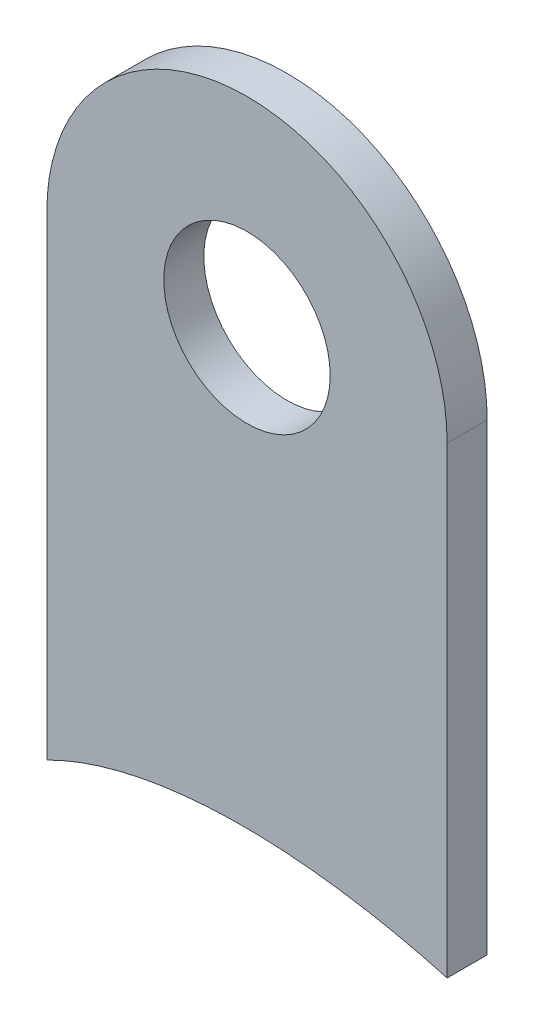
ISO-10303-21;
HEADER;
FILE_DESCRIPTION(('STEP AP214'),'2;1');
FILE_NAME('part.step','',(''),(''),'','','');
FILE_SCHEMA(('AUTOMOTIVE_DESIGN { 1 0 10303 214 1 1 1 1 }'));
ENDSEC;
DATA;
#1=APPLICATION_CONTEXT('core data for automotive mechanical design processes');
#2=APPLICATION_PROTOCOL_DEFINITION('international standard','automotive_design',2000,#1);
#3=PRODUCT_CONTEXT('',#1,'mechanical');
#4=PRODUCT('Part','Part','',(#3));
#5=PRODUCT_RELATED_PRODUCT_CATEGORY('part','',(#4));
#6=PRODUCT_DEFINITION_FORMATION('','',#4);
#7=PRODUCT_DEFINITION_CONTEXT('part definition',#1,'design');
#8=PRODUCT_DEFINITION('design','',#6,#7);
#9=PRODUCT_DEFINITION_SHAPE('','',#8);
#10=(LENGTH_UNIT() NAMED_UNIT(*) SI_UNIT(.MILLI.,.METRE.));
#11=(NAMED_UNIT(*) PLANE_ANGLE_UNIT() SI_UNIT($,.RADIAN.));
#12=(NAMED_UNIT(*) SI_UNIT($,.STERADIAN.) SOLID_ANGLE_UNIT());
#13=UNCERTAINTY_MEASURE_WITH_UNIT(LENGTH_MEASURE(1.E-05),#10,'distance_accuracy_value','');
#14=(GEOMETRIC_REPRESENTATION_CONTEXT(3) GLOBAL_UNCERTAINTY_ASSIGNED_CONTEXT((#13)) GLOBAL_UNIT_ASSIGNED_CONTEXT((#10,
#11,#12)) REPRESENTATION_CONTEXT('',''));
#15=CARTESIAN_POINT('',(0.,0.,0.));
#16=DIRECTION('',(0.,0.,1.));
#17=DIRECTION('',(1.,0.,0.));
#18=AXIS2_PLACEMENT_3D('',#15,#16,#17);
#19=CARTESIAN_POINT('',(0.,0.,1.5875));
#20=DIRECTION('',(0.,0.,-1.));
#21=DIRECTION('',(-1.,0.,0.));
#22=AXIS2_PLACEMENT_3D('',#19,#20,#21);
#23=CYLINDRICAL_SURFACE('',#22,7.9375);
#24=CARTESIAN_POINT('',(0.,0.,0.));
#25=DIRECTION('',(0.,0.,1.));
#26=DIRECTION('',(1.,0.,0.));
#27=AXIS2_PLACEMENT_3D('',#24,#25,#26);
#28=CIRCLE('',#27,7.9375);
#29=CARTESIAN_POINT('',(7.9375,0.,0.));
#30=VERTEX_POINT('',#29);
#31=CARTESIAN_POINT('',(-7.9375,0.,0.));
#32=VERTEX_POINT('',#31);
#33=EDGE_CURVE('E87',#30,#32,#28,.T.);
#34=ORIENTED_EDGE('',*,*,#33,.T.);
#35=DIRECTION('',(0.,0.,-1.));
#36=VECTOR('',#35,1.);
#37=CARTESIAN_POINT('',(-7.9375,0.,1.5875));
#38=LINE('',#37,#36);
#39=CARTESIAN_POINT('',(-7.9375,0.,1.5875));
#40=VERTEX_POINT('',#39);
#41=EDGE_CURVE('E11',#40,#32,#38,.T.);
#42=ORIENTED_EDGE('',*,*,#41,.F.);
#43=CARTESIAN_POINT('',(0.,0.,1.5875));
#44=DIRECTION('',(0.,0.,1.));
#45=DIRECTION('',(1.,0.,0.));
#46=AXIS2_PLACEMENT_3D('',#43,#44,#45);
#47=CIRCLE('',#46,7.9375);
#48=CARTESIAN_POINT('',(7.9375,0.,1.5875));
#49=VERTEX_POINT('',#48);
#50=EDGE_CURVE('E81',#49,#40,#47,.T.);
#51=ORIENTED_EDGE('',*,*,#50,.F.);
#52=DIRECTION('',(0.,0.,-1.));
#53=VECTOR('',#52,1.);
#54=CARTESIAN_POINT('',(7.9375,0.,1.5875));
#55=LINE('',#54,#53);
#56=EDGE_CURVE('E42',#49,#30,#55,.T.);
#57=ORIENTED_EDGE('',*,*,#56,.T.);
#58=EDGE_LOOP('',(#34,#42,#51,#57));
#59=FACE_BOUND('',#58,.T.);
#60=ADVANCED_FACE('F35',(#59),#23,.T.);
#61=CARTESIAN_POINT('',(-7.9375,0.,1.5875));
#62=DIRECTION('',(1.,0.,0.));
#63=DIRECTION('',(0.,1.,0.));
#64=AXIS2_PLACEMENT_3D('',#61,#62,#63);
#65=PLANE('',#64);
#66=DIRECTION('',(0.,-1.,0.));
#67=VECTOR('',#66,1.);
#68=CARTESIAN_POINT('',(-7.9375,0.,0.));
#69=LINE('',#68,#67);
#70=CARTESIAN_POINT('',(-7.9375,-18.8233181908482,0.));
#71=VERTEX_POINT('',#70);
#72=EDGE_CURVE('E82',#32,#71,#69,.T.);
#73=ORIENTED_EDGE('',*,*,#72,.T.);
#74=DIRECTION('',(0.,0.,-1.));
#75=VECTOR('',#74,1.);
#76=CARTESIAN_POINT('',(-7.9375,-18.8233181908482,1.5875));
#77=LINE('',#76,#75);
#78=CARTESIAN_POINT('',(-7.93749999999999,-18.8233181908482,1.5875));
#79=VERTEX_POINT('',#78);
#80=EDGE_CURVE('E49',#71,#79,#77,.F.);
#81=ORIENTED_EDGE('',*,*,#80,.T.);
#82=DIRECTION('',(0.,-1.,0.));
#83=VECTOR('',#82,1.);
#84=CARTESIAN_POINT('',(-7.9375,0.,1.5875));
#85=LINE('',#84,#83);
#86=EDGE_CURVE('E98',#40,#79,#85,.T.);
#87=ORIENTED_EDGE('',*,*,#86,.F.);
#88=ORIENTED_EDGE('',*,*,#41,.T.);
#89=EDGE_LOOP('',(#73,#81,#87,#88));
#90=FACE_BOUND('',#89,.T.);
#91=ADVANCED_FACE('F135',(#90),#65,.F.);
#92=CARTESIAN_POINT('',(7.9375,0.,1.5875));
#93=DIRECTION('',(-1.,0.,0.));
#94=DIRECTION('',(0.,-1.,0.));
#95=AXIS2_PLACEMENT_3D('',#92,#93,#94);
#96=PLANE('',#95);
#97=DIRECTION('',(0.,1.,0.));
#98=VECTOR('',#97,1.);
#99=CARTESIAN_POINT('',(7.9375,0.,1.5875));
#100=LINE('',#99,#98);
#101=CARTESIAN_POINT('',(7.93750000000328,-18.3708664452322,1.5875));
#102=VERTEX_POINT('',#101);
#103=EDGE_CURVE('E58',#102,#49,#100,.T.);
#104=ORIENTED_EDGE('',*,*,#103,.F.);
#105=DIRECTION('',(0.,0.,-1.));
#106=VECTOR('',#105,1.);
#107=CARTESIAN_POINT('',(7.9375,-18.3708664452313,1.5875));
#108=LINE('',#107,#106);
#109=CARTESIAN_POINT('',(7.93750000000328,-18.3708664452322,0.));
#110=VERTEX_POINT('',#109);
#111=EDGE_CURVE('E78',#102,#110,#108,.T.);
#112=ORIENTED_EDGE('',*,*,#111,.T.);
#113=DIRECTION('',(0.,1.,0.));
#114=VECTOR('',#113,1.);
#115=CARTESIAN_POINT('',(7.9375,0.,0.));
#116=LINE('',#115,#114);
#117=EDGE_CURVE('E72',#110,#30,#116,.T.);
#118=ORIENTED_EDGE('',*,*,#117,.T.);
#119=ORIENTED_EDGE('',*,*,#56,.F.);
#120=EDGE_LOOP('',(#104,#112,#118,#119));
#121=FACE_BOUND('',#120,.T.);
#122=ADVANCED_FACE('F74',(#121),#96,.F.);
#123=CARTESIAN_POINT('',(0.,0.,1.5875));
#124=DIRECTION('',(0.,0.,1.));
#125=DIRECTION('',(1.,0.,0.));
#126=AXIS2_PLACEMENT_3D('',#123,#124,#125);
#127=PLANE('',#126);
#128=CARTESIAN_POINT('',(-12.0302858960899,-22.899436182964,1.5875));
#129=CARTESIAN_POINT('',(-1.65246713113241,0.283766306806422,1.5875));
#130=CARTESIAN_POINT('',(38.2842648459578,-17.5936674388465,1.5875));
#131=CARTESIAN_POINT('',(27.9064460810003,-40.7768699286169,1.5875));
#132=CARTESIAN_POINT('',(17.5286273160427,-63.9600724183873,1.5875));
#133=CARTESIAN_POINT('',(-22.4081046610475,-46.0826386727343,1.5875));
#134=CARTESIAN_POINT('',(-12.0302858960899,-22.899436182964,1.5875));
#135=(BOUNDED_CURVE() B_SPLINE_CURVE(3,(#128,#129,#130,#131,#132,#133,#134),.UNSPECIFIED.,.T.,
.F.) B_SPLINE_CURVE_WITH_KNOTS((4,3,4),(0.,0.5,1.),
.UNSPECIFIED.) CURVE() GEOMETRIC_REPRESENTATION_ITEM() RATIONAL_B_SPLINE_CURVE((1.,
0.333333333333333,0.333333333333333,1.,0.333333333333333,0.333333333333333,1.)) REPRESENTATION_ITEM(''));
#136=EDGE_CURVE('E106',#79,#102,#135,.T.);
#137=ORIENTED_EDGE('',*,*,#136,.T.);
#138=ORIENTED_EDGE('',*,*,#103,.T.);
#139=ORIENTED_EDGE('',*,*,#50,.T.);
#140=ORIENTED_EDGE('',*,*,#86,.T.);
#141=EDGE_LOOP('',(#137,#138,#139,#140));
#142=FACE_BOUND('',#141,.T.);
#143=CARTESIAN_POINT('',(0.,0.,1.5875));
#144=DIRECTION('',(0.,0.,1.));
#145=DIRECTION('',(1.,0.,0.));
#146=AXIS2_PLACEMENT_3D('',#143,#144,#145);
#147=CIRCLE('',#146,3.3);
#148=CARTESIAN_POINT('',(3.3,0.,1.5875));
#149=VERTEX_POINT('',#148);
#150=EDGE_CURVE('E94',#149,#149,#147,.T.);
#151=ORIENTED_EDGE('',*,*,#150,.F.);
#152=EDGE_LOOP('',(#151));
#153=FACE_BOUND('',#152,.T.);
#154=ADVANCED_FACE('F128',(#142,#153),#127,.T.);
#155=CARTESIAN_POINT('',(0.,0.,0.));
#156=DIRECTION('',(0.,0.,1.));
#157=DIRECTION('',(1.,0.,0.));
#158=AXIS2_PLACEMENT_3D('',#155,#156,#157);
#159=PLANE('',#158);
#160=CARTESIAN_POINT('',(0.,0.,0.));
#161=DIRECTION('',(0.,0.,1.));
#162=DIRECTION('',(1.,0.,0.));
#163=AXIS2_PLACEMENT_3D('',#160,#161,#162);
#164=CIRCLE('',#163,3.3);
#165=CARTESIAN_POINT('',(3.3,0.,0.));
#166=VERTEX_POINT('',#165);
#167=EDGE_CURVE('E90',#166,#166,#164,.T.);
#168=ORIENTED_EDGE('',*,*,#167,.T.);
#169=EDGE_LOOP('',(#168));
#170=FACE_BOUND('',#169,.T.);
#171=ORIENTED_EDGE('',*,*,#117,.F.);
#172=CARTESIAN_POINT('',(-12.0302858960899,-22.899436182964,0.));
#173=CARTESIAN_POINT('',(-1.65246713113241,0.283766306806422,0.));
#174=CARTESIAN_POINT('',(38.2842648459578,-17.5936674388465,0.));
#175=CARTESIAN_POINT('',(27.9064460810003,-40.7768699286169,0.));
#176=CARTESIAN_POINT('',(17.5286273160427,-63.9600724183873,0.));
#177=CARTESIAN_POINT('',(-22.4081046610475,-46.0826386727343,0.));
#178=CARTESIAN_POINT('',(-12.0302858960899,-22.899436182964,0.));
#179=(BOUNDED_CURVE() B_SPLINE_CURVE(3,(#172,#173,#174,#175,#176,#177,#178),.UNSPECIFIED.,.T.,
.F.) B_SPLINE_CURVE_WITH_KNOTS((4,3,4),(0.,0.5,1.),
.UNSPECIFIED.) CURVE() GEOMETRIC_REPRESENTATION_ITEM() RATIONAL_B_SPLINE_CURVE((1.,
0.333333333333333,0.333333333333333,1.,0.333333333333333,0.333333333333333,1.)) REPRESENTATION_ITEM(''));
#180=EDGE_CURVE('E107',#71,#110,#179,.T.);
#181=ORIENTED_EDGE('',*,*,#180,.F.);
#182=ORIENTED_EDGE('',*,*,#72,.F.);
#183=ORIENTED_EDGE('',*,*,#33,.F.);
#184=EDGE_LOOP('',(#171,#181,#182,#183));
#185=FACE_BOUND('',#184,.T.);
#186=ADVANCED_FACE('F88',(#170,#185),#159,.F.);
#187=CARTESIAN_POINT('',(0.,0.,1.5875));
#188=DIRECTION('',(0.,0.,1.));
#189=DIRECTION('',(1.,0.,0.));
#190=AXIS2_PLACEMENT_3D('',#187,#188,#189);
#191=CYLINDRICAL_SURFACE('',#190,3.3);
#192=ORIENTED_EDGE('',*,*,#167,.F.);
#193=EDGE_LOOP('',(#192));
#194=FACE_BOUND('',#193,.T.);
#195=ORIENTED_EDGE('',*,*,#150,.T.);
#196=EDGE_LOOP('',(#195));
#197=FACE_BOUND('',#196,.T.);
#198=ADVANCED_FACE('F124',(#194,#197),#191,.F.);
#199=DIRECTION('',(0.,0.,-1.));
#200=VECTOR('',#199,1.);
#201=SURFACE_OF_LINEAR_EXTRUSION('',#135,#200);
#202=ORIENTED_EDGE('',*,*,#180,.T.);
#203=ORIENTED_EDGE('',*,*,#111,.F.);
#204=ORIENTED_EDGE('',*,*,#136,.F.);
#205=ORIENTED_EDGE('',*,*,#80,.F.);
#206=EDGE_LOOP('',(#202,#203,#204,#205));
#207=FACE_BOUND('',#206,.T.);
#208=ADVANCED_FACE('F121',(#207),#201,.F.);
#209=CLOSED_SHELL('',(#60,#91,#122,#154,#186,#198,#208));
#210=MANIFOLD_SOLID_BREP('B2',#209);
#211=ADVANCED_BREP_SHAPE_REPRESENTATION('',(#18,#210),#14);
#212=SHAPE_DEFINITION_REPRESENTATION(#9,#211);
ENDSEC;
END-ISO-10303-21;
